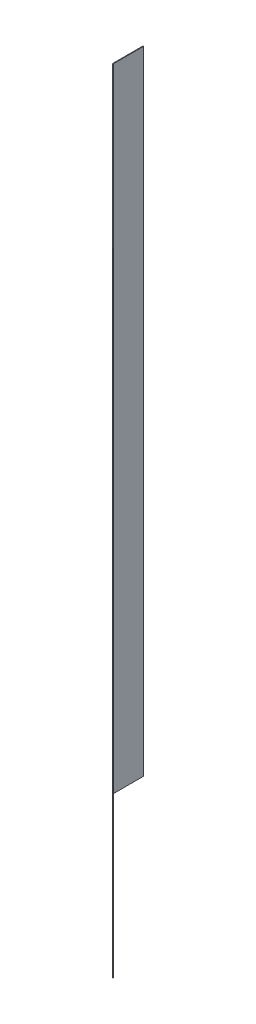
ISO-10303-21;
HEADER;
FILE_DESCRIPTION(('STEP AP214'),'2;1');
FILE_NAME('part.step','',(''),(''),'','','');
FILE_SCHEMA(('AUTOMOTIVE_DESIGN { 1 0 10303 214 1 1 1 1 }'));
ENDSEC;
DATA;
#1=APPLICATION_CONTEXT('core data for automotive mechanical design processes');
#2=APPLICATION_PROTOCOL_DEFINITION('international standard','automotive_design',2000,#1);
#3=PRODUCT_CONTEXT('',#1,'mechanical');
#4=PRODUCT('Part','Part','',(#3));
#5=PRODUCT_RELATED_PRODUCT_CATEGORY('part','',(#4));
#6=PRODUCT_DEFINITION_FORMATION('','',#4);
#7=PRODUCT_DEFINITION_CONTEXT('part definition',#1,'design');
#8=PRODUCT_DEFINITION('design','',#6,#7);
#9=PRODUCT_DEFINITION_SHAPE('','',#8);
#10=(LENGTH_UNIT() NAMED_UNIT(*) SI_UNIT(.MILLI.,.METRE.));
#11=(NAMED_UNIT(*) PLANE_ANGLE_UNIT() SI_UNIT($,.RADIAN.));
#12=(NAMED_UNIT(*) SI_UNIT($,.STERADIAN.) SOLID_ANGLE_UNIT());
#13=UNCERTAINTY_MEASURE_WITH_UNIT(LENGTH_MEASURE(1.E-05),#10,'distance_accuracy_value','');
#14=(GEOMETRIC_REPRESENTATION_CONTEXT(3) GLOBAL_UNCERTAINTY_ASSIGNED_CONTEXT((#13)) GLOBAL_UNIT_ASSIGNED_CONTEXT((#10,
#11,#12)) REPRESENTATION_CONTEXT('',''));
#15=CARTESIAN_POINT('',(0.,0.,0.));
#16=DIRECTION('',(0.,0.,1.));
#17=DIRECTION('',(1.,0.,0.));
#18=AXIS2_PLACEMENT_3D('',#15,#16,#17);
#19=CARTESIAN_POINT('',(0.234314575050769,840.,40.2343145750508));
#20=DIRECTION('',(0.,1.,0.));
#21=DIRECTION('',(0.,0.,1.));
#22=AXIS2_PLACEMENT_3D('',#19,#20,#21);
#23=PLANE('',#22);
#24=DIRECTION('',(-0.707106781186546,0.,0.707106781186549));
#25=VECTOR('',#24,1.);
#26=CARTESIAN_POINT('',(0.234314575050769,840.,40.2343145750508));
#27=LINE('',#26,#25);
#28=CARTESIAN_POINT('',(0.234314575050769,840.,40.2343145750508));
#29=VERTEX_POINT('',#28);
#30=CARTESIAN_POINT('',(-0.331370849898468,840.,40.8));
#31=VERTEX_POINT('',#30);
#32=EDGE_CURVE('E11',#29,#31,#27,.T.);
#33=ORIENTED_EDGE('',*,*,#32,.F.);
#34=CARTESIAN_POINT('',(0.800000000000004,840.,39.6686291501015));
#35=DIRECTION('',(0.,-1.,0.));
#36=DIRECTION('',(0.,0.,-1.));
#37=AXIS2_PLACEMENT_3D('',#34,#35,#36);
#38=CIRCLE('',#37,0.8);
#39=CARTESIAN_POINT('',(0.,840.,39.6686291501015));
#40=VERTEX_POINT('',#39);
#41=EDGE_CURVE('E130',#40,#29,#38,.F.);
#42=ORIENTED_EDGE('',*,*,#41,.F.);
#43=DIRECTION('',(1.,0.,0.));
#44=VECTOR('',#43,1.);
#45=CARTESIAN_POINT('',(-0.799999999999996,840.,39.6686291501015));
#46=LINE('',#45,#44);
#47=CARTESIAN_POINT('',(-0.799999999999996,840.,39.6686291501015));
#48=VERTEX_POINT('',#47);
#49=EDGE_CURVE('E41',#48,#40,#46,.T.);
#50=ORIENTED_EDGE('',*,*,#49,.F.);
#51=CARTESIAN_POINT('',(0.800000000000004,840.,39.6686291501015));
#52=DIRECTION('',(0.,1.,0.));
#53=DIRECTION('',(1.,0.,0.));
#54=AXIS2_PLACEMENT_3D('',#51,#52,#53);
#55=CIRCLE('',#54,1.6);
#56=EDGE_CURVE('E123',#48,#31,#55,.T.);
#57=ORIENTED_EDGE('',*,*,#56,.T.);
#58=EDGE_LOOP('',(#33,#42,#50,#57));
#59=FACE_BOUND('',#58,.T.);
#60=ADVANCED_FACE('F33',(#59),#23,.T.);
#61=CARTESIAN_POINT('',(-0.799999999999996,840.,39.6686291501015));
#62=DIRECTION('',(0.,1.,0.));
#63=DIRECTION('',(0.,0.,1.));
#64=AXIS2_PLACEMENT_3D('',#61,#62,#63);
#65=PLANE('',#64);
#66=DIRECTION('',(0.707106781186549,0.,0.707106781186546));
#67=VECTOR('',#66,1.);
#68=CARTESIAN_POINT('',(0.,840.,40.));
#69=LINE('',#68,#67);
#70=CARTESIAN_POINT('',(212.132034355965,840.,252.132034355964));
#71=VERTEX_POINT('',#70);
#72=EDGE_CURVE('E179',#29,#71,#69,.T.);
#73=ORIENTED_EDGE('',*,*,#72,.F.);
#74=ORIENTED_EDGE('',*,*,#32,.T.);
#75=DIRECTION('',(0.707106781186549,0.,0.707106781186546));
#76=VECTOR('',#75,1.);
#77=CARTESIAN_POINT('',(-0.565685424949232,840.,40.5656854249492));
#78=LINE('',#77,#76);
#79=CARTESIAN_POINT('',(211.566348931016,840.,252.697719780913));
#80=VERTEX_POINT('',#79);
#81=EDGE_CURVE('E89',#31,#80,#78,.T.);
#82=ORIENTED_EDGE('',*,*,#81,.T.);
#83=DIRECTION('',(-0.707106781186513,0.,0.707106781186582));
#84=VECTOR('',#83,1.);
#85=CARTESIAN_POINT('',(212.132034355965,840.,252.132034355964));
#86=LINE('',#85,#84);
#87=EDGE_CURVE('E336',#71,#80,#86,.T.);
#88=ORIENTED_EDGE('',*,*,#87,.F.);
#89=EDGE_LOOP('',(#73,#74,#82,#88));
#90=FACE_BOUND('',#89,.T.);
#91=ADVANCED_FACE('F187',(#90),#65,.T.);
#92=CARTESIAN_POINT('',(0.,0.,39.6686291501015));
#93=DIRECTION('',(0.,-1.,0.));
#94=DIRECTION('',(0.,0.,-1.));
#95=AXIS2_PLACEMENT_3D('',#92,#93,#94);
#96=PLANE('',#95);
#97=DIRECTION('',(-1.,0.,0.));
#98=VECTOR('',#97,1.);
#99=CARTESIAN_POINT('',(0.,0.,39.6686291501015));
#100=LINE('',#99,#98);
#101=CARTESIAN_POINT('',(0.,0.,39.6686291501015));
#102=VERTEX_POINT('',#101);
#103=CARTESIAN_POINT('',(-0.799999999999996,0.,39.6686291501015));
#104=VERTEX_POINT('',#103);
#105=EDGE_CURVE('E76',#102,#104,#100,.T.);
#106=ORIENTED_EDGE('',*,*,#105,.F.);
#107=CARTESIAN_POINT('',(0.800000000000004,0.,39.6686291501015));
#108=DIRECTION('',(0.,-1.,0.));
#109=DIRECTION('',(0.,0.,-1.));
#110=AXIS2_PLACEMENT_3D('',#107,#108,#109);
#111=CIRCLE('',#110,0.8);
#112=CARTESIAN_POINT('',(0.234314575050769,0.,40.2343145750508));
#113=VERTEX_POINT('',#112);
#114=EDGE_CURVE('E145',#102,#113,#111,.F.);
#115=ORIENTED_EDGE('',*,*,#114,.T.);
#116=DIRECTION('',(0.707106781186546,0.,-0.707106781186549));
#117=VECTOR('',#116,1.);
#118=CARTESIAN_POINT('',(-0.331370849898468,0.,40.8));
#119=LINE('',#118,#117);
#120=CARTESIAN_POINT('',(-0.331370849898468,0.,40.8));
#121=VERTEX_POINT('',#120);
#122=EDGE_CURVE('E83',#121,#113,#119,.T.);
#123=ORIENTED_EDGE('',*,*,#122,.F.);
#124=CARTESIAN_POINT('',(0.800000000000004,0.,39.6686291501015));
#125=DIRECTION('',(0.,1.,0.));
#126=DIRECTION('',(1.,0.,0.));
#127=AXIS2_PLACEMENT_3D('',#124,#125,#126);
#128=CIRCLE('',#127,1.6);
#129=EDGE_CURVE('E152',#104,#121,#128,.T.);
#130=ORIENTED_EDGE('',*,*,#129,.F.);
#131=EDGE_LOOP('',(#106,#115,#123,#130));
#132=FACE_BOUND('',#131,.T.);
#133=ADVANCED_FACE('F185',(#132),#96,.T.);
#134=CARTESIAN_POINT('',(-0.331370849898468,0.,40.8));
#135=DIRECTION('',(0.,-1.,0.));
#136=DIRECTION('',(0.,0.,-1.));
#137=AXIS2_PLACEMENT_3D('',#134,#135,#136);
#138=PLANE('',#137);
#139=DIRECTION('',(0.,0.,1.));
#140=VECTOR('',#139,1.);
#141=CARTESIAN_POINT('',(0.,0.,0.));
#142=LINE('',#141,#140);
#143=CARTESIAN_POINT('',(0.,0.,0.));
#144=VERTEX_POINT('',#143);
#145=EDGE_CURVE('E147',#144,#102,#142,.T.);
#146=ORIENTED_EDGE('',*,*,#145,.T.);
#147=ORIENTED_EDGE('',*,*,#105,.T.);
#148=DIRECTION('',(0.,0.,1.));
#149=VECTOR('',#148,1.);
#150=CARTESIAN_POINT('',(-0.8,0.,0.));
#151=LINE('',#150,#149);
#152=CARTESIAN_POINT('',(-0.8,0.,0.));
#153=VERTEX_POINT('',#152);
#154=EDGE_CURVE('E150',#153,#104,#151,.T.);
#155=ORIENTED_EDGE('',*,*,#154,.F.);
#156=DIRECTION('',(1.,0.,0.));
#157=VECTOR('',#156,1.);
#158=CARTESIAN_POINT('',(-0.8,0.,0.));
#159=LINE('',#158,#157);
#160=EDGE_CURVE('E111',#153,#144,#159,.T.);
#161=ORIENTED_EDGE('',*,*,#160,.T.);
#162=EDGE_LOOP('',(#146,#147,#155,#161));
#163=FACE_BOUND('',#162,.T.);
#164=ADVANCED_FACE('F181',(#163),#138,.T.);
#165=CARTESIAN_POINT('',(-0.565685424949232,840.,40.5656854249492));
#166=DIRECTION('',(0.707106781186546,0.,-0.707106781186549));
#167=DIRECTION('',(-0.707106781186549,0.,-0.707106781186546));
#168=AXIS2_PLACEMENT_3D('',#165,#166,#167);
#169=PLANE('',#168);
#170=DIRECTION('',(0.707106781186549,0.,0.707106781186546));
#171=VECTOR('',#170,1.);
#172=CARTESIAN_POINT('',(-0.565685424949232,0.,40.5656854249492));
#173=LINE('',#172,#171);
#174=CARTESIAN_POINT('',(211.566348931016,0.,252.697719780913));
#175=VERTEX_POINT('',#174);
#176=EDGE_CURVE('E136',#121,#175,#173,.T.);
#177=ORIENTED_EDGE('',*,*,#176,.T.);
#178=DIRECTION('',(0.,-1.,0.));
#179=VECTOR('',#178,1.);
#180=CARTESIAN_POINT('',(211.566348931016,840.,252.697719780913));
#181=LINE('',#180,#179);
#182=EDGE_CURVE('E166',#80,#175,#181,.T.);
#183=ORIENTED_EDGE('',*,*,#182,.F.);
#184=ORIENTED_EDGE('',*,*,#81,.F.);
#185=DIRECTION('',(0.,-1.,0.));
#186=VECTOR('',#185,1.);
#187=CARTESIAN_POINT('',(-0.331370849898468,840.,40.8));
#188=LINE('',#187,#186);
#189=EDGE_CURVE('E135',#31,#121,#188,.T.);
#190=ORIENTED_EDGE('',*,*,#189,.T.);
#191=EDGE_LOOP('',(#177,#183,#184,#190));
#192=FACE_BOUND('',#191,.T.);
#193=ADVANCED_FACE('F193',(#192),#169,.F.);
#194=CARTESIAN_POINT('',(212.132034355965,840.,252.132034355964));
#195=DIRECTION('',(0.707106781186582,0.,0.707106781186513));
#196=DIRECTION('',(0.707106781186513,0.,-0.707106781186582));
#197=AXIS2_PLACEMENT_3D('',#194,#195,#196);
#198=PLANE('',#197);
#199=DIRECTION('',(-0.707106781186513,0.,0.707106781186582));
#200=VECTOR('',#199,1.);
#201=CARTESIAN_POINT('',(212.132034355965,0.,252.132034355964));
#202=LINE('',#201,#200);
#203=CARTESIAN_POINT('',(212.132034355965,0.,252.132034355964));
#204=VERTEX_POINT('',#203);
#205=EDGE_CURVE('E139',#204,#175,#202,.T.);
#206=ORIENTED_EDGE('',*,*,#205,.F.);
#207=DIRECTION('',(0.,-1.,0.));
#208=VECTOR('',#207,1.);
#209=CARTESIAN_POINT('',(212.132034355965,840.,252.132034355964));
#210=LINE('',#209,#208);
#211=EDGE_CURVE('E164',#71,#204,#210,.T.);
#212=ORIENTED_EDGE('',*,*,#211,.F.);
#213=ORIENTED_EDGE('',*,*,#87,.T.);
#214=ORIENTED_EDGE('',*,*,#182,.T.);
#215=EDGE_LOOP('',(#206,#212,#213,#214));
#216=FACE_BOUND('',#215,.T.);
#217=ADVANCED_FACE('F224',(#216),#198,.T.);
#218=CARTESIAN_POINT('',(0.,840.,40.));
#219=DIRECTION('',(0.707106781186546,0.,-0.707106781186549));
#220=DIRECTION('',(-0.707106781186549,0.,-0.707106781186546));
#221=AXIS2_PLACEMENT_3D('',#218,#219,#220);
#222=PLANE('',#221);
#223=DIRECTION('',(0.707106781186549,0.,0.707106781186546));
#224=VECTOR('',#223,1.);
#225=CARTESIAN_POINT('',(0.,0.,40.));
#226=LINE('',#225,#224);
#227=EDGE_CURVE('E142',#113,#204,#226,.T.);
#228=ORIENTED_EDGE('',*,*,#227,.F.);
#229=DIRECTION('',(0.,-1.,0.));
#230=VECTOR('',#229,1.);
#231=CARTESIAN_POINT('',(0.234314575050769,840.,40.2343145750508));
#232=LINE('',#231,#230);
#233=EDGE_CURVE('E161',#29,#113,#232,.T.);
#234=ORIENTED_EDGE('',*,*,#233,.F.);
#235=ORIENTED_EDGE('',*,*,#72,.T.);
#236=ORIENTED_EDGE('',*,*,#211,.T.);
#237=EDGE_LOOP('',(#228,#234,#235,#236));
#238=FACE_BOUND('',#237,.T.);
#239=ADVANCED_FACE('F235',(#238),#222,.T.);
#240=CARTESIAN_POINT('',(0.800000000000004,840.,39.6686291501015));
#241=DIRECTION('',(0.,-1.,0.));
#242=DIRECTION('',(0.,0.,-1.));
#243=AXIS2_PLACEMENT_3D('',#240,#241,#242);
#244=CYLINDRICAL_SURFACE('',#243,0.8);
#245=ORIENTED_EDGE('',*,*,#114,.F.);
#246=DIRECTION('',(0.,-1.,0.));
#247=VECTOR('',#246,1.);
#248=CARTESIAN_POINT('',(0.,840.,39.6686291501015));
#249=LINE('',#248,#247);
#250=EDGE_CURVE('E158',#40,#102,#249,.T.);
#251=ORIENTED_EDGE('',*,*,#250,.F.);
#252=ORIENTED_EDGE('',*,*,#41,.T.);
#253=ORIENTED_EDGE('',*,*,#233,.T.);
#254=EDGE_LOOP('',(#245,#251,#252,#253));
#255=FACE_BOUND('',#254,.T.);
#256=ADVANCED_FACE('F175',(#255),#244,.F.);
#257=CARTESIAN_POINT('',(0.,840.,0.));
#258=DIRECTION('',(1.,0.,0.));
#259=DIRECTION('',(0.,0.,-1.));
#260=AXIS2_PLACEMENT_3D('',#257,#258,#259);
#261=PLANE('',#260);
#262=ORIENTED_EDGE('',*,*,#145,.F.);
#263=DIRECTION('',(0.,-1.,0.));
#264=VECTOR('',#263,1.);
#265=CARTESIAN_POINT('',(0.,840.,0.));
#266=LINE('',#265,#264);
#267=CARTESIAN_POINT('',(0.,840.,0.));
#268=VERTEX_POINT('',#267);
#269=EDGE_CURVE('E113',#268,#144,#266,.T.);
#270=ORIENTED_EDGE('',*,*,#269,.F.);
#271=DIRECTION('',(0.,0.,1.));
#272=VECTOR('',#271,1.);
#273=CARTESIAN_POINT('',(0.,840.,0.));
#274=LINE('',#273,#272);
#275=EDGE_CURVE('E128',#268,#40,#274,.T.);
#276=ORIENTED_EDGE('',*,*,#275,.T.);
#277=ORIENTED_EDGE('',*,*,#250,.T.);
#278=EDGE_LOOP('',(#262,#270,#276,#277));
#279=FACE_BOUND('',#278,.T.);
#280=ADVANCED_FACE('F180',(#279),#261,.T.);
#281=CARTESIAN_POINT('',(-0.8,840.,0.));
#282=DIRECTION('',(0.,0.,-1.));
#283=DIRECTION('',(-1.,0.,0.));
#284=AXIS2_PLACEMENT_3D('',#281,#282,#283);
#285=PLANE('',#284);
#286=ORIENTED_EDGE('',*,*,#160,.F.);
#287=DIRECTION('',(0.,-1.,0.));
#288=VECTOR('',#287,1.);
#289=CARTESIAN_POINT('',(-0.8,840.,0.));
#290=LINE('',#289,#288);
#291=CARTESIAN_POINT('',(-0.8,840.,0.));
#292=VERTEX_POINT('',#291);
#293=EDGE_CURVE('E105',#292,#153,#290,.T.);
#294=ORIENTED_EDGE('',*,*,#293,.F.);
#295=DIRECTION('',(1.,0.,0.));
#296=VECTOR('',#295,1.);
#297=CARTESIAN_POINT('',(-0.8,840.,0.));
#298=LINE('',#297,#296);
#299=EDGE_CURVE('E109',#292,#268,#298,.T.);
#300=ORIENTED_EDGE('',*,*,#299,.T.);
#301=ORIENTED_EDGE('',*,*,#269,.T.);
#302=EDGE_LOOP('',(#286,#294,#300,#301));
#303=FACE_BOUND('',#302,.T.);
#304=ADVANCED_FACE('F107',(#303),#285,.T.);
#305=CARTESIAN_POINT('',(-0.8,840.,0.));
#306=DIRECTION('',(1.,0.,0.));
#307=DIRECTION('',(0.,0.,-1.));
#308=AXIS2_PLACEMENT_3D('',#305,#306,#307);
#309=PLANE('',#308);
#310=ORIENTED_EDGE('',*,*,#154,.T.);
#311=DIRECTION('',(0.,-1.,0.));
#312=VECTOR('',#311,1.);
#313=CARTESIAN_POINT('',(-0.799999999999996,840.,39.6686291501015));
#314=LINE('',#313,#312);
#315=EDGE_CURVE('E114',#48,#104,#314,.T.);
#316=ORIENTED_EDGE('',*,*,#315,.F.);
#317=DIRECTION('',(0.,0.,1.));
#318=VECTOR('',#317,1.);
#319=CARTESIAN_POINT('',(-0.8,840.,0.));
#320=LINE('',#319,#318);
#321=EDGE_CURVE('E118',#292,#48,#320,.T.);
#322=ORIENTED_EDGE('',*,*,#321,.F.);
#323=ORIENTED_EDGE('',*,*,#293,.T.);
#324=EDGE_LOOP('',(#310,#316,#322,#323));
#325=FACE_BOUND('',#324,.T.);
#326=ADVANCED_FACE('F119',(#325),#309,.F.);
#327=CARTESIAN_POINT('',(0.800000000000004,840.,39.6686291501015));
#328=DIRECTION('',(0.,-1.,0.));
#329=DIRECTION('',(0.,0.,-1.));
#330=AXIS2_PLACEMENT_3D('',#327,#328,#329);
#331=CYLINDRICAL_SURFACE('',#330,1.6);
#332=ORIENTED_EDGE('',*,*,#129,.T.);
#333=ORIENTED_EDGE('',*,*,#189,.F.);
#334=ORIENTED_EDGE('',*,*,#56,.F.);
#335=ORIENTED_EDGE('',*,*,#315,.T.);
#336=EDGE_LOOP('',(#332,#333,#334,#335));
#337=FACE_BOUND('',#336,.T.);
#338=ADVANCED_FACE('F183',(#337),#331,.T.);
#339=CARTESIAN_POINT('',(0.800000000000004,840.,39.6686291501015));
#340=DIRECTION('',(0.,-1.,0.));
#341=DIRECTION('',(0.,0.,-1.));
#342=AXIS2_PLACEMENT_3D('',#339,#340,#341);
#343=PLANE('',#342);
#344=ORIENTED_EDGE('',*,*,#321,.T.);
#345=ORIENTED_EDGE('',*,*,#49,.T.);
#346=ORIENTED_EDGE('',*,*,#275,.F.);
#347=ORIENTED_EDGE('',*,*,#299,.F.);
#348=EDGE_LOOP('',(#344,#345,#346,#347));
#349=FACE_BOUND('',#348,.T.);
#350=ADVANCED_FACE('F126',(#349),#343,.F.);
#351=CARTESIAN_POINT('',(0.800000000000004,0.,39.6686291501015));
#352=DIRECTION('',(0.,-1.,0.));
#353=DIRECTION('',(0.,0.,-1.));
#354=AXIS2_PLACEMENT_3D('',#351,#352,#353);
#355=PLANE('',#354);
#356=ORIENTED_EDGE('',*,*,#176,.F.);
#357=ORIENTED_EDGE('',*,*,#122,.T.);
#358=ORIENTED_EDGE('',*,*,#227,.T.);
#359=ORIENTED_EDGE('',*,*,#205,.T.);
#360=EDGE_LOOP('',(#356,#357,#358,#359));
#361=FACE_BOUND('',#360,.T.);
#362=ADVANCED_FACE('F301',(#361),#355,.T.);
#363=CLOSED_SHELL('',(#60,#91,#133,#164,#193,#217,#239,#256,#280,#304,#326,#338,#350,#362));
#364=MANIFOLD_SOLID_BREP('B2',#363);
#365=ADVANCED_BREP_SHAPE_REPRESENTATION('',(#18,#364),#14);
#366=SHAPE_DEFINITION_REPRESENTATION(#9,#365);
ENDSEC;
END-ISO-10303-21;
